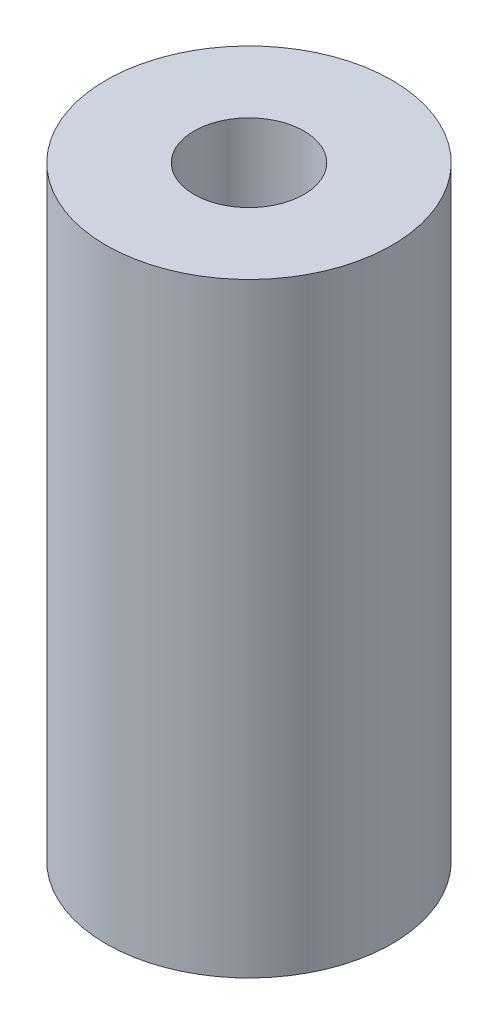
ISO-10303-21;
HEADER;
FILE_DESCRIPTION(('STEP AP214'),'2;1');
FILE_NAME('part.step','',(''),(''),'','','');
FILE_SCHEMA(('AUTOMOTIVE_DESIGN { 1 0 10303 214 1 1 1 1 }'));
ENDSEC;
DATA;
#1=APPLICATION_CONTEXT('core data for automotive mechanical design processes');
#2=APPLICATION_PROTOCOL_DEFINITION('international standard','automotive_design',2000,#1);
#3=PRODUCT_CONTEXT('',#1,'mechanical');
#4=PRODUCT('Part','Part','',(#3));
#5=PRODUCT_RELATED_PRODUCT_CATEGORY('part','',(#4));
#6=PRODUCT_DEFINITION_FORMATION('','',#4);
#7=PRODUCT_DEFINITION_CONTEXT('part definition',#1,'design');
#8=PRODUCT_DEFINITION('design','',#6,#7);
#9=PRODUCT_DEFINITION_SHAPE('','',#8);
#10=(LENGTH_UNIT() NAMED_UNIT(*) SI_UNIT(.MILLI.,.METRE.));
#11=(NAMED_UNIT(*) PLANE_ANGLE_UNIT() SI_UNIT($,.RADIAN.));
#12=(NAMED_UNIT(*) SI_UNIT($,.STERADIAN.) SOLID_ANGLE_UNIT());
#13=UNCERTAINTY_MEASURE_WITH_UNIT(LENGTH_MEASURE(1.E-05),#10,'distance_accuracy_value','');
#14=(GEOMETRIC_REPRESENTATION_CONTEXT(3) GLOBAL_UNCERTAINTY_ASSIGNED_CONTEXT((#13)) GLOBAL_UNIT_ASSIGNED_CONTEXT((#10,
#11,#12)) REPRESENTATION_CONTEXT('',''));
#15=CARTESIAN_POINT('',(0.,0.,0.));
#16=DIRECTION('',(0.,0.,1.));
#17=DIRECTION('',(1.,0.,0.));
#18=AXIS2_PLACEMENT_3D('',#15,#16,#17);
#19=CARTESIAN_POINT('',(0.,11.,0.));
#20=DIRECTION('',(0.,1.,0.));
#21=DIRECTION('',(0.,0.,1.));
#22=AXIS2_PLACEMENT_3D('',#19,#20,#21);
#23=PLANE('',#22);
#24=CARTESIAN_POINT('',(0.,11.,0.));
#25=DIRECTION('',(0.,1.,0.));
#26=DIRECTION('',(0.,0.,1.));
#27=AXIS2_PLACEMENT_3D('',#24,#25,#26);
#28=CIRCLE('',#27,2.6);
#29=CARTESIAN_POINT('',(0.,11.,2.6));
#30=VERTEX_POINT('',#29);
#31=EDGE_CURVE('E10',#30,#30,#28,.T.);
#32=ORIENTED_EDGE('',*,*,#31,.T.);
#33=EDGE_LOOP('',(#32));
#34=FACE_BOUND('',#33,.T.);
#35=CARTESIAN_POINT('',(0.,11.,0.));
#36=DIRECTION('',(0.,1.,0.));
#37=DIRECTION('',(0.,0.,1.));
#38=AXIS2_PLACEMENT_3D('',#35,#36,#37);
#39=CIRCLE('',#38,1.);
#40=CARTESIAN_POINT('',(0.,11.,1.));
#41=VERTEX_POINT('',#40);
#42=EDGE_CURVE('E50',#41,#41,#39,.T.);
#43=ORIENTED_EDGE('',*,*,#42,.F.);
#44=EDGE_LOOP('',(#43));
#45=FACE_BOUND('',#44,.T.);
#46=ADVANCED_FACE('F37',(#34,#45),#23,.T.);
#47=CARTESIAN_POINT('',(0.,0.,0.));
#48=DIRECTION('',(0.,1.,0.));
#49=DIRECTION('',(0.,0.,1.));
#50=AXIS2_PLACEMENT_3D('',#47,#48,#49);
#51=PLANE('',#50);
#52=CARTESIAN_POINT('',(0.,0.,0.));
#53=DIRECTION('',(0.,1.,0.));
#54=DIRECTION('',(0.,0.,1.));
#55=AXIS2_PLACEMENT_3D('',#52,#53,#54);
#56=CIRCLE('',#55,2.6);
#57=CARTESIAN_POINT('',(0.,0.,2.6));
#58=VERTEX_POINT('',#57);
#59=EDGE_CURVE('E41',#58,#58,#56,.T.);
#60=ORIENTED_EDGE('',*,*,#59,.F.);
#61=EDGE_LOOP('',(#60));
#62=FACE_BOUND('',#61,.T.);
#63=CARTESIAN_POINT('',(0.,0.,0.));
#64=DIRECTION('',(0.,1.,0.));
#65=DIRECTION('',(0.,0.,1.));
#66=AXIS2_PLACEMENT_3D('',#63,#64,#65);
#67=CIRCLE('',#66,1.);
#68=CARTESIAN_POINT('',(0.,0.,1.));
#69=VERTEX_POINT('',#68);
#70=EDGE_CURVE('E52',#69,#69,#67,.T.);
#71=ORIENTED_EDGE('',*,*,#70,.T.);
#72=EDGE_LOOP('',(#71));
#73=FACE_BOUND('',#72,.T.);
#74=ADVANCED_FACE('F64',(#62,#73),#51,.F.);
#75=CARTESIAN_POINT('',(0.,11.,0.));
#76=DIRECTION('',(0.,-1.,0.));
#77=DIRECTION('',(0.,0.,-1.));
#78=AXIS2_PLACEMENT_3D('',#75,#76,#77);
#79=CYLINDRICAL_SURFACE('',#78,2.6);
#80=ORIENTED_EDGE('',*,*,#31,.F.);
#81=EDGE_LOOP('',(#80));
#82=FACE_BOUND('',#81,.T.);
#83=ORIENTED_EDGE('',*,*,#59,.T.);
#84=EDGE_LOOP('',(#83));
#85=FACE_BOUND('',#84,.T.);
#86=ADVANCED_FACE('F39',(#82,#85),#79,.T.);
#87=CARTESIAN_POINT('',(0.,11.,0.));
#88=DIRECTION('',(0.,-1.,0.));
#89=DIRECTION('',(0.,0.,-1.));
#90=AXIS2_PLACEMENT_3D('',#87,#88,#89);
#91=CYLINDRICAL_SURFACE('',#90,1.);
#92=ORIENTED_EDGE('',*,*,#42,.T.);
#93=EDGE_LOOP('',(#92));
#94=FACE_BOUND('',#93,.T.);
#95=ORIENTED_EDGE('',*,*,#70,.F.);
#96=EDGE_LOOP('',(#95));
#97=FACE_BOUND('',#96,.T.);
#98=ADVANCED_FACE('F60',(#94,#97),#91,.F.);
#99=CLOSED_SHELL('',(#46,#74,#86,#98));
#100=MANIFOLD_SOLID_BREP('B2',#99);
#101=ADVANCED_BREP_SHAPE_REPRESENTATION('',(#18,#100),#14);
#102=SHAPE_DEFINITION_REPRESENTATION(#9,#101);
ENDSEC;
END-ISO-10303-21;
